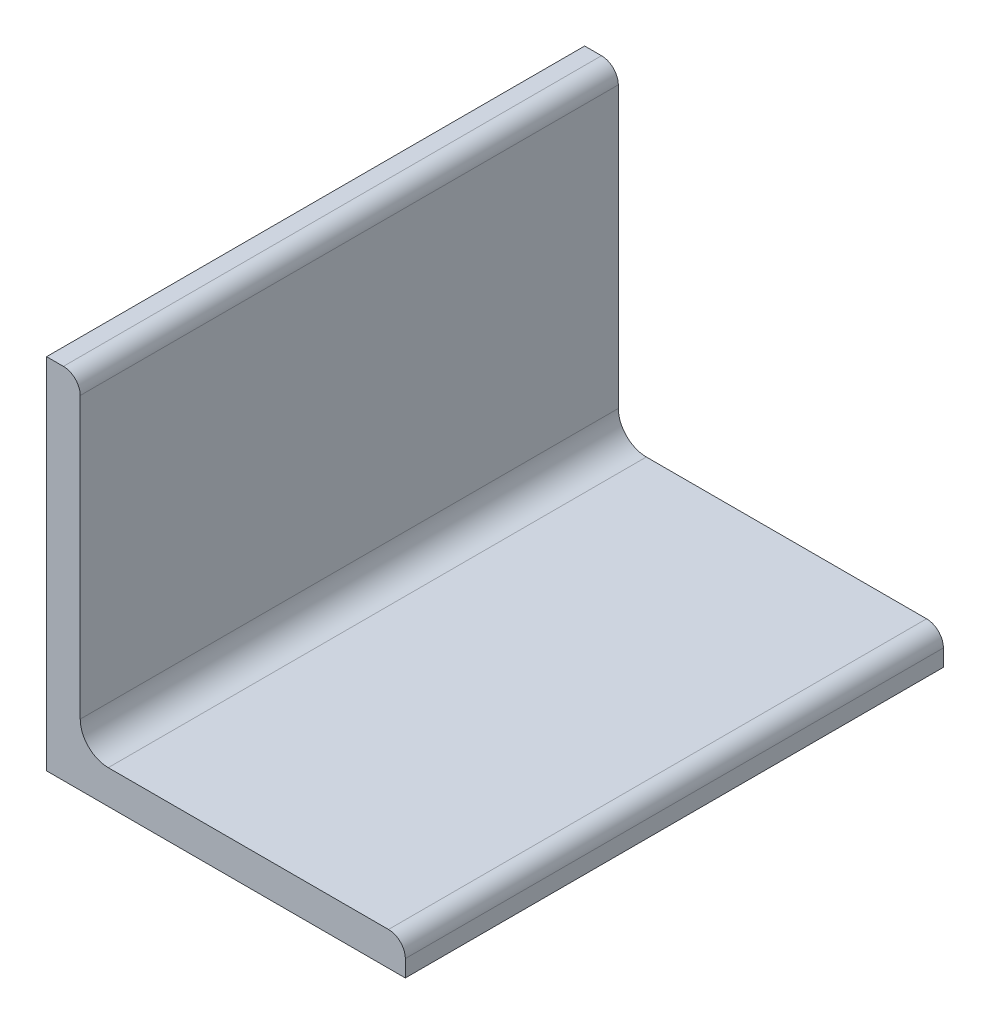
ISO-10303-21;
HEADER;
FILE_DESCRIPTION(('STEP AP214'),'2;1');
FILE_NAME('part.step','',(''),(''),'','','');
FILE_SCHEMA(('AUTOMOTIVE_DESIGN { 1 0 10303 214 1 1 1 1 }'));
ENDSEC;
DATA;
#1=APPLICATION_CONTEXT('core data for automotive mechanical design processes');
#2=APPLICATION_PROTOCOL_DEFINITION('international standard','automotive_design',2000,#1);
#3=PRODUCT_CONTEXT('',#1,'mechanical');
#4=PRODUCT('Part','Part','',(#3));
#5=PRODUCT_RELATED_PRODUCT_CATEGORY('part','',(#4));
#6=PRODUCT_DEFINITION_FORMATION('','',#4);
#7=PRODUCT_DEFINITION_CONTEXT('part definition',#1,'design');
#8=PRODUCT_DEFINITION('design','',#6,#7);
#9=PRODUCT_DEFINITION_SHAPE('','',#8);
#10=(LENGTH_UNIT() NAMED_UNIT(*) SI_UNIT(.MILLI.,.METRE.));
#11=(NAMED_UNIT(*) PLANE_ANGLE_UNIT() SI_UNIT($,.RADIAN.));
#12=(NAMED_UNIT(*) SI_UNIT($,.STERADIAN.) SOLID_ANGLE_UNIT());
#13=UNCERTAINTY_MEASURE_WITH_UNIT(LENGTH_MEASURE(1.E-05),#10,'distance_accuracy_value','');
#14=(GEOMETRIC_REPRESENTATION_CONTEXT(3) GLOBAL_UNCERTAINTY_ASSIGNED_CONTEXT((#13)) GLOBAL_UNIT_ASSIGNED_CONTEXT((#10,
#11,#12)) REPRESENTATION_CONTEXT('',''));
#15=CARTESIAN_POINT('',(0.,0.,0.));
#16=DIRECTION('',(0.,0.,1.));
#17=DIRECTION('',(1.,0.,0.));
#18=AXIS2_PLACEMENT_3D('',#15,#16,#17);
#19=CARTESIAN_POINT('',(1.17355224493876,203.678837479772,304.8));
#20=DIRECTION('',(1.,0.,0.));
#21=DIRECTION('',(0.,0.,-1.));
#22=AXIS2_PLACEMENT_3D('',#19,#20,#21);
#23=PLANE('',#22);
#24=DIRECTION('',(0.,-1.,0.));
#25=VECTOR('',#24,1.);
#26=CARTESIAN_POINT('',(1.17355224493876,203.678837479772,0.));
#27=LINE('',#26,#25);
#28=CARTESIAN_POINT('',(1.17355224493876,203.678837479772,0.));
#29=VERTEX_POINT('',#28);
#30=CARTESIAN_POINT('',(1.17355224493876,0.478837479771528,0.));
#31=VERTEX_POINT('',#30);
#32=EDGE_CURVE('E135',#29,#31,#27,.T.);
#33=ORIENTED_EDGE('',*,*,#32,.T.);
#34=DIRECTION('',(0.,0.,-1.));
#35=VECTOR('',#34,1.);
#36=CARTESIAN_POINT('',(1.17355224493876,0.478837479771528,304.8));
#37=LINE('',#36,#35);
#38=CARTESIAN_POINT('',(1.17355224493876,0.478837479771528,304.8));
#39=VERTEX_POINT('',#38);
#40=EDGE_CURVE('E11',#39,#31,#37,.T.);
#41=ORIENTED_EDGE('',*,*,#40,.F.);
#42=DIRECTION('',(0.,-1.,0.));
#43=VECTOR('',#42,1.);
#44=CARTESIAN_POINT('',(1.17355224493876,203.678837479772,304.8));
#45=LINE('',#44,#43);
#46=CARTESIAN_POINT('',(1.17355224493876,203.678837479772,304.8));
#47=VERTEX_POINT('',#46);
#48=EDGE_CURVE('E151',#47,#39,#45,.T.);
#49=ORIENTED_EDGE('',*,*,#48,.F.);
#50=DIRECTION('',(0.,0.,-1.));
#51=VECTOR('',#50,1.);
#52=CARTESIAN_POINT('',(1.17355224493876,203.678837479772,304.8));
#53=LINE('',#52,#51);
#54=EDGE_CURVE('E131',#47,#29,#53,.T.);
#55=ORIENTED_EDGE('',*,*,#54,.T.);
#56=EDGE_LOOP('',(#33,#41,#49,#55));
#57=FACE_BOUND('',#56,.T.);
#58=ADVANCED_FACE('F33',(#57),#23,.F.);
#59=CARTESIAN_POINT('',(1.17355224493876,0.478837479771528,304.8));
#60=DIRECTION('',(0.,1.,0.));
#61=DIRECTION('',(0.,0.,1.));
#62=AXIS2_PLACEMENT_3D('',#59,#60,#61);
#63=PLANE('',#62);
#64=DIRECTION('',(1.,0.,0.));
#65=VECTOR('',#64,1.);
#66=CARTESIAN_POINT('',(1.17355224493876,0.478837479771528,0.));
#67=LINE('',#66,#65);
#68=CARTESIAN_POINT('',(204.373552244939,0.478837479771528,0.));
#69=VERTEX_POINT('',#68);
#70=EDGE_CURVE('E138',#31,#69,#67,.T.);
#71=ORIENTED_EDGE('',*,*,#70,.T.);
#72=DIRECTION('',(0.,0.,-1.));
#73=VECTOR('',#72,1.);
#74=CARTESIAN_POINT('',(204.373552244939,0.478837479771528,304.8));
#75=LINE('',#74,#73);
#76=CARTESIAN_POINT('',(204.373552244939,0.478837479771528,304.8));
#77=VERTEX_POINT('',#76);
#78=EDGE_CURVE('E41',#77,#69,#75,.T.);
#79=ORIENTED_EDGE('',*,*,#78,.F.);
#80=DIRECTION('',(1.,0.,0.));
#81=VECTOR('',#80,1.);
#82=CARTESIAN_POINT('',(1.17355224493876,0.478837479771528,304.8));
#83=LINE('',#82,#81);
#84=EDGE_CURVE('E95',#39,#77,#83,.T.);
#85=ORIENTED_EDGE('',*,*,#84,.F.);
#86=ORIENTED_EDGE('',*,*,#40,.T.);
#87=EDGE_LOOP('',(#71,#79,#85,#86));
#88=FACE_BOUND('',#87,.T.);
#89=ADVANCED_FACE('F194',(#88),#63,.F.);
#90=CARTESIAN_POINT('',(204.373552244939,0.478837479771528,304.8));
#91=DIRECTION('',(-1.,0.,0.));
#92=DIRECTION('',(0.,0.,1.));
#93=AXIS2_PLACEMENT_3D('',#90,#91,#92);
#94=PLANE('',#93);
#95=DIRECTION('',(0.,1.,0.));
#96=VECTOR('',#95,1.);
#97=CARTESIAN_POINT('',(204.373552244939,0.478837479771528,0.));
#98=LINE('',#97,#96);
#99=CARTESIAN_POINT('',(204.373552244939,10.0038374797715,0.));
#100=VERTEX_POINT('',#99);
#101=EDGE_CURVE('E140',#69,#100,#98,.T.);
#102=ORIENTED_EDGE('',*,*,#101,.T.);
#103=DIRECTION('',(0.,0.,-1.));
#104=VECTOR('',#103,1.);
#105=CARTESIAN_POINT('',(204.373552244939,10.0038374797715,304.8));
#106=LINE('',#105,#104);
#107=CARTESIAN_POINT('',(204.373552244939,10.0038374797715,304.8));
#108=VERTEX_POINT('',#107);
#109=EDGE_CURVE('E161',#108,#100,#106,.T.);
#110=ORIENTED_EDGE('',*,*,#109,.F.);
#111=DIRECTION('',(0.,1.,0.));
#112=VECTOR('',#111,1.);
#113=CARTESIAN_POINT('',(204.373552244939,0.478837479771528,304.8));
#114=LINE('',#113,#112);
#115=EDGE_CURVE('E169',#77,#108,#114,.T.);
#116=ORIENTED_EDGE('',*,*,#115,.F.);
#117=ORIENTED_EDGE('',*,*,#78,.T.);
#118=EDGE_LOOP('',(#102,#110,#116,#117));
#119=FACE_BOUND('',#118,.T.);
#120=ADVANCED_FACE('F167',(#119),#94,.F.);
#121=CARTESIAN_POINT('',(194.848552244939,10.0038374797715,304.8));
#122=DIRECTION('',(0.,0.,-1.));
#123=DIRECTION('',(-1.,0.,0.));
#124=AXIS2_PLACEMENT_3D('',#121,#122,#123);
#125=CYLINDRICAL_SURFACE('',#124,9.525);
#126=CARTESIAN_POINT('',(194.848552244939,10.0038374797715,0.));
#127=DIRECTION('',(0.,0.,1.));
#128=DIRECTION('',(1.,0.,0.));
#129=AXIS2_PLACEMENT_3D('',#126,#127,#128);
#130=CIRCLE('',#129,9.525);
#131=CARTESIAN_POINT('',(194.848552244939,19.5288374797715,0.));
#132=VERTEX_POINT('',#131);
#133=EDGE_CURVE('E142',#100,#132,#130,.T.);
#134=ORIENTED_EDGE('',*,*,#133,.T.);
#135=DIRECTION('',(0.,0.,-1.));
#136=VECTOR('',#135,1.);
#137=CARTESIAN_POINT('',(194.848552244939,19.5288374797715,304.8));
#138=LINE('',#137,#136);
#139=CARTESIAN_POINT('',(194.848552244939,19.5288374797715,304.8));
#140=VERTEX_POINT('',#139);
#141=EDGE_CURVE('E158',#140,#132,#138,.T.);
#142=ORIENTED_EDGE('',*,*,#141,.F.);
#143=CARTESIAN_POINT('',(194.848552244939,10.0038374797715,304.8));
#144=DIRECTION('',(0.,0.,1.));
#145=DIRECTION('',(1.,0.,0.));
#146=AXIS2_PLACEMENT_3D('',#143,#144,#145);
#147=CIRCLE('',#146,9.525);
#148=EDGE_CURVE('E185',#108,#140,#147,.T.);
#149=ORIENTED_EDGE('',*,*,#148,.F.);
#150=ORIENTED_EDGE('',*,*,#109,.T.);
#151=EDGE_LOOP('',(#134,#142,#149,#150));
#152=FACE_BOUND('',#151,.T.);
#153=ADVANCED_FACE('F178',(#152),#125,.T.);
#154=CARTESIAN_POINT('',(194.848552244939,19.5288374797715,304.8));
#155=DIRECTION('',(0.,-1.,0.));
#156=DIRECTION('',(1.,0.,0.));
#157=AXIS2_PLACEMENT_3D('',#154,#155,#156);
#158=PLANE('',#157);
#159=DIRECTION('',(-1.,0.,0.));
#160=VECTOR('',#159,1.);
#161=CARTESIAN_POINT('',(194.848552244939,19.5288374797715,0.));
#162=LINE('',#161,#160);
#163=CARTESIAN_POINT('',(36.0985522449388,19.5288374797715,0.));
#164=VERTEX_POINT('',#163);
#165=EDGE_CURVE('E144',#132,#164,#162,.T.);
#166=ORIENTED_EDGE('',*,*,#165,.T.);
#167=DIRECTION('',(0.,0.,-1.));
#168=VECTOR('',#167,1.);
#169=CARTESIAN_POINT('',(36.0985522449388,19.5288374797715,304.8));
#170=LINE('',#169,#168);
#171=CARTESIAN_POINT('',(36.0985522449388,19.5288374797715,304.8));
#172=VERTEX_POINT('',#171);
#173=EDGE_CURVE('E155',#172,#164,#170,.T.);
#174=ORIENTED_EDGE('',*,*,#173,.F.);
#175=DIRECTION('',(-1.,0.,0.));
#176=VECTOR('',#175,1.);
#177=CARTESIAN_POINT('',(194.848552244939,19.5288374797715,304.8));
#178=LINE('',#177,#176);
#179=EDGE_CURVE('E184',#140,#172,#178,.T.);
#180=ORIENTED_EDGE('',*,*,#179,.F.);
#181=ORIENTED_EDGE('',*,*,#141,.T.);
#182=EDGE_LOOP('',(#166,#174,#180,#181));
#183=FACE_BOUND('',#182,.T.);
#184=ADVANCED_FACE('F182',(#183),#158,.F.);
#185=CARTESIAN_POINT('',(36.0985522449387,35.4038374797715,304.8));
#186=DIRECTION('',(0.,0.,-1.));
#187=DIRECTION('',(-1.,0.,0.));
#188=AXIS2_PLACEMENT_3D('',#185,#186,#187);
#189=CYLINDRICAL_SURFACE('',#188,15.875);
#190=CARTESIAN_POINT('',(36.0985522449387,35.4038374797715,0.));
#191=DIRECTION('',(0.,0.,-1.));
#192=DIRECTION('',(1.,0.,0.));
#193=AXIS2_PLACEMENT_3D('',#190,#191,#192);
#194=CIRCLE('',#193,15.875);
#195=CARTESIAN_POINT('',(20.2235522449388,35.4038374797715,0.));
#196=VERTEX_POINT('',#195);
#197=EDGE_CURVE('E146',#164,#196,#194,.T.);
#198=ORIENTED_EDGE('',*,*,#197,.T.);
#199=DIRECTION('',(0.,0.,-1.));
#200=VECTOR('',#199,1.);
#201=CARTESIAN_POINT('',(20.2235522449388,35.4038374797715,304.8));
#202=LINE('',#201,#200);
#203=CARTESIAN_POINT('',(20.2235522449388,35.4038374797715,304.8));
#204=VERTEX_POINT('',#203);
#205=EDGE_CURVE('E126',#204,#196,#202,.T.);
#206=ORIENTED_EDGE('',*,*,#205,.F.);
#207=CARTESIAN_POINT('',(36.0985522449387,35.4038374797715,304.8));
#208=DIRECTION('',(0.,0.,-1.));
#209=DIRECTION('',(1.,0.,0.));
#210=AXIS2_PLACEMENT_3D('',#207,#208,#209);
#211=CIRCLE('',#210,15.875);
#212=EDGE_CURVE('E117',#172,#204,#211,.T.);
#213=ORIENTED_EDGE('',*,*,#212,.F.);
#214=ORIENTED_EDGE('',*,*,#173,.T.);
#215=EDGE_LOOP('',(#198,#206,#213,#214));
#216=FACE_BOUND('',#215,.T.);
#217=ADVANCED_FACE('F206',(#216),#189,.F.);
#218=CARTESIAN_POINT('',(20.2235522449388,35.4038374797715,304.8));
#219=DIRECTION('',(-1.,0.,0.));
#220=DIRECTION('',(0.,0.,1.));
#221=AXIS2_PLACEMENT_3D('',#218,#219,#220);
#222=PLANE('',#221);
#223=DIRECTION('',(0.,1.,0.));
#224=VECTOR('',#223,1.);
#225=CARTESIAN_POINT('',(20.2235522449388,35.4038374797715,0.));
#226=LINE('',#225,#224);
#227=CARTESIAN_POINT('',(20.2235522449388,194.153837479772,0.));
#228=VERTEX_POINT('',#227);
#229=EDGE_CURVE('E125',#196,#228,#226,.T.);
#230=ORIENTED_EDGE('',*,*,#229,.T.);
#231=DIRECTION('',(0.,0.,-1.));
#232=VECTOR('',#231,1.);
#233=CARTESIAN_POINT('',(20.2235522449388,194.153837479772,304.8));
#234=LINE('',#233,#232);
#235=CARTESIAN_POINT('',(20.2235522449388,194.153837479772,304.8));
#236=VERTEX_POINT('',#235);
#237=EDGE_CURVE('E122',#236,#228,#234,.T.);
#238=ORIENTED_EDGE('',*,*,#237,.F.);
#239=DIRECTION('',(0.,1.,0.));
#240=VECTOR('',#239,1.);
#241=CARTESIAN_POINT('',(20.2235522449388,35.4038374797715,304.8));
#242=LINE('',#241,#240);
#243=EDGE_CURVE('E111',#204,#236,#242,.T.);
#244=ORIENTED_EDGE('',*,*,#243,.F.);
#245=ORIENTED_EDGE('',*,*,#205,.T.);
#246=EDGE_LOOP('',(#230,#238,#244,#245));
#247=FACE_BOUND('',#246,.T.);
#248=ADVANCED_FACE('F123',(#247),#222,.F.);
#249=CARTESIAN_POINT('',(10.6985522449388,194.153837479772,304.8));
#250=DIRECTION('',(0.,0.,-1.));
#251=DIRECTION('',(-1.,0.,0.));
#252=AXIS2_PLACEMENT_3D('',#249,#250,#251);
#253=CYLINDRICAL_SURFACE('',#252,9.525);
#254=CARTESIAN_POINT('',(10.6985522449388,194.153837479772,0.));
#255=DIRECTION('',(0.,0.,1.));
#256=DIRECTION('',(1.,0.,0.));
#257=AXIS2_PLACEMENT_3D('',#254,#255,#256);
#258=CIRCLE('',#257,9.525);
#259=CARTESIAN_POINT('',(10.6985522449388,203.678837479772,0.));
#260=VERTEX_POINT('',#259);
#261=EDGE_CURVE('E81',#228,#260,#258,.T.);
#262=ORIENTED_EDGE('',*,*,#261,.T.);
#263=DIRECTION('',(0.,0.,-1.));
#264=VECTOR('',#263,1.);
#265=CARTESIAN_POINT('',(10.6985522449388,203.678837479772,304.8));
#266=LINE('',#265,#264);
#267=CARTESIAN_POINT('',(10.6985522449388,203.678837479772,304.8));
#268=VERTEX_POINT('',#267);
#269=EDGE_CURVE('E127',#268,#260,#266,.T.);
#270=ORIENTED_EDGE('',*,*,#269,.F.);
#271=CARTESIAN_POINT('',(10.6985522449388,194.153837479772,304.8));
#272=DIRECTION('',(0.,0.,1.));
#273=DIRECTION('',(1.,0.,0.));
#274=AXIS2_PLACEMENT_3D('',#271,#272,#273);
#275=CIRCLE('',#274,9.525);
#276=EDGE_CURVE('E115',#236,#268,#275,.T.);
#277=ORIENTED_EDGE('',*,*,#276,.F.);
#278=ORIENTED_EDGE('',*,*,#237,.T.);
#279=EDGE_LOOP('',(#262,#270,#277,#278));
#280=FACE_BOUND('',#279,.T.);
#281=ADVANCED_FACE('F129',(#280),#253,.T.);
#282=CARTESIAN_POINT('',(10.6985522449388,203.678837479772,304.8));
#283=DIRECTION('',(0.,-1.,0.));
#284=DIRECTION('',(0.,0.,-1.));
#285=AXIS2_PLACEMENT_3D('',#282,#283,#284);
#286=PLANE('',#285);
#287=DIRECTION('',(-1.,0.,0.));
#288=VECTOR('',#287,1.);
#289=CARTESIAN_POINT('',(10.6985522449388,203.678837479772,0.));
#290=LINE('',#289,#288);
#291=EDGE_CURVE('E87',#260,#29,#290,.T.);
#292=ORIENTED_EDGE('',*,*,#291,.T.);
#293=ORIENTED_EDGE('',*,*,#54,.F.);
#294=DIRECTION('',(-1.,0.,0.));
#295=VECTOR('',#294,1.);
#296=CARTESIAN_POINT('',(10.6985522449388,203.678837479772,304.8));
#297=LINE('',#296,#295);
#298=EDGE_CURVE('E49',#268,#47,#297,.T.);
#299=ORIENTED_EDGE('',*,*,#298,.F.);
#300=ORIENTED_EDGE('',*,*,#269,.T.);
#301=EDGE_LOOP('',(#292,#293,#299,#300));
#302=FACE_BOUND('',#301,.T.);
#303=ADVANCED_FACE('F214',(#302),#286,.F.);
#304=CARTESIAN_POINT('',(194.848552244939,10.0038374797715,304.8));
#305=DIRECTION('',(0.,0.,1.));
#306=DIRECTION('',(1.,0.,0.));
#307=AXIS2_PLACEMENT_3D('',#304,#305,#306);
#308=PLANE('',#307);
#309=ORIENTED_EDGE('',*,*,#48,.T.);
#310=ORIENTED_EDGE('',*,*,#84,.T.);
#311=ORIENTED_EDGE('',*,*,#115,.T.);
#312=ORIENTED_EDGE('',*,*,#148,.T.);
#313=ORIENTED_EDGE('',*,*,#179,.T.);
#314=ORIENTED_EDGE('',*,*,#212,.T.);
#315=ORIENTED_EDGE('',*,*,#243,.T.);
#316=ORIENTED_EDGE('',*,*,#276,.T.);
#317=ORIENTED_EDGE('',*,*,#298,.T.);
#318=EDGE_LOOP('',(#309,#310,#311,#312,#313,#314,#315,#316,#317));
#319=FACE_BOUND('',#318,.T.);
#320=ADVANCED_FACE('F113',(#319),#308,.T.);
#321=CARTESIAN_POINT('',(194.848552244939,10.0038374797715,0.));
#322=DIRECTION('',(0.,0.,1.));
#323=DIRECTION('',(1.,0.,0.));
#324=AXIS2_PLACEMENT_3D('',#321,#322,#323);
#325=PLANE('',#324);
#326=ORIENTED_EDGE('',*,*,#32,.F.);
#327=ORIENTED_EDGE('',*,*,#291,.F.);
#328=ORIENTED_EDGE('',*,*,#261,.F.);
#329=ORIENTED_EDGE('',*,*,#229,.F.);
#330=ORIENTED_EDGE('',*,*,#197,.F.);
#331=ORIENTED_EDGE('',*,*,#165,.F.);
#332=ORIENTED_EDGE('',*,*,#133,.F.);
#333=ORIENTED_EDGE('',*,*,#101,.F.);
#334=ORIENTED_EDGE('',*,*,#70,.F.);
#335=EDGE_LOOP('',(#326,#327,#328,#329,#330,#331,#332,#333,#334));
#336=FACE_BOUND('',#335,.T.);
#337=ADVANCED_FACE('F173',(#336),#325,.F.);
#338=CLOSED_SHELL('',(#58,#89,#120,#153,#184,#217,#248,#281,#303,#320,#337));
#339=MANIFOLD_SOLID_BREP('B2',#338);
#340=ADVANCED_BREP_SHAPE_REPRESENTATION('',(#18,#339),#14);
#341=SHAPE_DEFINITION_REPRESENTATION(#9,#340);
ENDSEC;
END-ISO-10303-21;
